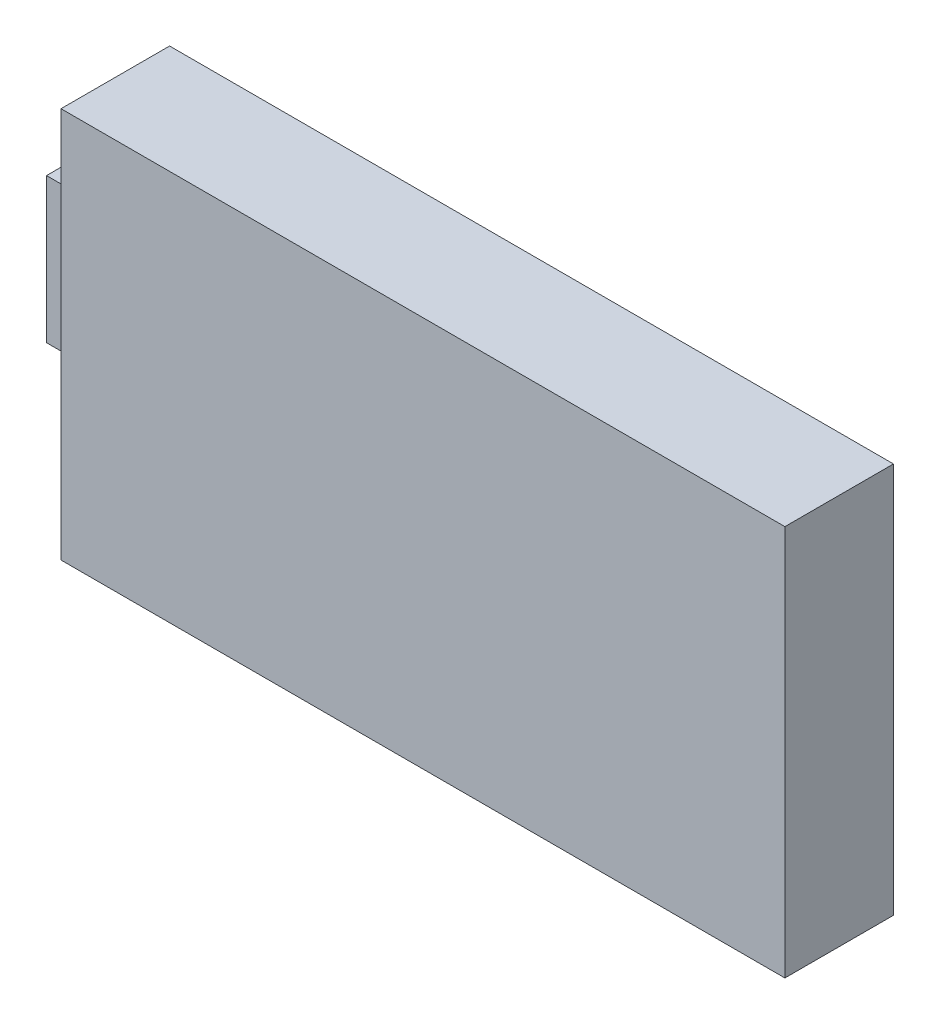
ISO-10303-21;
HEADER;
FILE_DESCRIPTION(('STEP AP214'),'2;1');
FILE_NAME('part.step','',(''),(''),'','','');
FILE_SCHEMA(('AUTOMOTIVE_DESIGN { 1 0 10303 214 1 1 1 1 }'));
ENDSEC;
DATA;
#1=APPLICATION_CONTEXT('core data for automotive mechanical design processes');
#2=APPLICATION_PROTOCOL_DEFINITION('international standard','automotive_design',2000,#1);
#3=PRODUCT_CONTEXT('',#1,'mechanical');
#4=PRODUCT('Part','Part','',(#3));
#5=PRODUCT_RELATED_PRODUCT_CATEGORY('part','',(#4));
#6=PRODUCT_DEFINITION_FORMATION('','',#4);
#7=PRODUCT_DEFINITION_CONTEXT('part definition',#1,'design');
#8=PRODUCT_DEFINITION('design','',#6,#7);
#9=PRODUCT_DEFINITION_SHAPE('','',#8);
#10=(LENGTH_UNIT() NAMED_UNIT(*) SI_UNIT(.MILLI.,.METRE.));
#11=(NAMED_UNIT(*) PLANE_ANGLE_UNIT() SI_UNIT($,.RADIAN.));
#12=(NAMED_UNIT(*) SI_UNIT($,.STERADIAN.) SOLID_ANGLE_UNIT());
#13=UNCERTAINTY_MEASURE_WITH_UNIT(LENGTH_MEASURE(1.E-05),#10,'distance_accuracy_value','');
#14=(GEOMETRIC_REPRESENTATION_CONTEXT(3) GLOBAL_UNCERTAINTY_ASSIGNED_CONTEXT((#13)) GLOBAL_UNIT_ASSIGNED_CONTEXT((#10,
#11,#12)) REPRESENTATION_CONTEXT('',''));
#15=CARTESIAN_POINT('',(0.,0.,0.));
#16=DIRECTION('',(0.,0.,1.));
#17=DIRECTION('',(1.,0.,0.));
#18=AXIS2_PLACEMENT_3D('',#15,#16,#17);
#19=CARTESIAN_POINT('',(-25.,13.5,7.5));
#20=DIRECTION('',(1.,0.,0.));
#21=DIRECTION('',(0.,1.,0.));
#22=AXIS2_PLACEMENT_3D('',#19,#20,#21);
#23=PLANE('',#22);
#24=DIRECTION('',(0.,0.,-1.));
#25=VECTOR('',#24,1.);
#26=CARTESIAN_POINT('',(-25.,5.,0.));
#27=LINE('',#26,#25);
#28=CARTESIAN_POINT('',(-25.,5.,3.5));
#29=VERTEX_POINT('',#28);
#30=CARTESIAN_POINT('',(-25.,5.,0.));
#31=VERTEX_POINT('',#30);
#32=EDGE_CURVE('E52',#29,#31,#27,.T.);
#33=ORIENTED_EDGE('',*,*,#32,.F.);
#34=DIRECTION('',(0.,1.,0.));
#35=VECTOR('',#34,1.);
#36=CARTESIAN_POINT('',(-25.,5.,3.5));
#37=LINE('',#36,#35);
#38=CARTESIAN_POINT('',(-25.,-5.,3.5));
#39=VERTEX_POINT('',#38);
#40=EDGE_CURVE('E139',#39,#29,#37,.T.);
#41=ORIENTED_EDGE('',*,*,#40,.F.);
#42=DIRECTION('',(0.,0.,1.));
#43=VECTOR('',#42,1.);
#44=CARTESIAN_POINT('',(-25.,-5.,0.));
#45=LINE('',#44,#43);
#46=CARTESIAN_POINT('',(-25.,-5.,0.));
#47=VERTEX_POINT('',#46);
#48=EDGE_CURVE('E58',#47,#39,#45,.T.);
#49=ORIENTED_EDGE('',*,*,#48,.F.);
#50=DIRECTION('',(0.,-1.,0.));
#51=VECTOR('',#50,1.);
#52=CARTESIAN_POINT('',(-25.,13.5,0.));
#53=LINE('',#52,#51);
#54=CARTESIAN_POINT('',(-25.,-13.5,0.));
#55=VERTEX_POINT('',#54);
#56=EDGE_CURVE('E124',#47,#55,#53,.T.);
#57=ORIENTED_EDGE('',*,*,#56,.T.);
#58=DIRECTION('',(0.,0.,-1.));
#59=VECTOR('',#58,1.);
#60=CARTESIAN_POINT('',(-25.,-13.5,7.5));
#61=LINE('',#60,#59);
#62=CARTESIAN_POINT('',(-25.,-13.5,7.5));
#63=VERTEX_POINT('',#62);
#64=EDGE_CURVE('E169',#63,#55,#61,.T.);
#65=ORIENTED_EDGE('',*,*,#64,.F.);
#66=DIRECTION('',(0.,-1.,0.));
#67=VECTOR('',#66,1.);
#68=CARTESIAN_POINT('',(-25.,13.5,7.5));
#69=LINE('',#68,#67);
#70=CARTESIAN_POINT('',(-25.,13.5,7.5));
#71=VERTEX_POINT('',#70);
#72=EDGE_CURVE('E153',#71,#63,#69,.T.);
#73=ORIENTED_EDGE('',*,*,#72,.F.);
#74=DIRECTION('',(0.,0.,-1.));
#75=VECTOR('',#74,1.);
#76=CARTESIAN_POINT('',(-25.,13.5,7.5));
#77=LINE('',#76,#75);
#78=CARTESIAN_POINT('',(-25.,13.5,0.));
#79=VERTEX_POINT('',#78);
#80=EDGE_CURVE('E44',#71,#79,#77,.T.);
#81=ORIENTED_EDGE('',*,*,#80,.T.);
#82=EDGE_CURVE('E165',#79,#31,#53,.T.);
#83=ORIENTED_EDGE('',*,*,#82,.T.);
#84=EDGE_LOOP('',(#33,#41,#49,#57,#65,#73,#81,#83));
#85=FACE_BOUND('',#84,.T.);
#86=ADVANCED_FACE('F35',(#85),#23,.F.);
#87=CARTESIAN_POINT('',(25.,13.5,7.5));
#88=DIRECTION('',(-1.,0.,0.));
#89=DIRECTION('',(0.,-1.,0.));
#90=AXIS2_PLACEMENT_3D('',#87,#88,#89);
#91=PLANE('',#90);
#92=DIRECTION('',(0.,1.,0.));
#93=VECTOR('',#92,1.);
#94=CARTESIAN_POINT('',(25.,13.5,0.));
#95=LINE('',#94,#93);
#96=CARTESIAN_POINT('',(25.,-13.5,0.));
#97=VERTEX_POINT('',#96);
#98=CARTESIAN_POINT('',(25.,13.5,0.));
#99=VERTEX_POINT('',#98);
#100=EDGE_CURVE('E125',#97,#99,#95,.T.);
#101=ORIENTED_EDGE('',*,*,#100,.T.);
#102=DIRECTION('',(0.,0.,-1.));
#103=VECTOR('',#102,1.);
#104=CARTESIAN_POINT('',(25.,13.5,7.5));
#105=LINE('',#104,#103);
#106=CARTESIAN_POINT('',(25.,13.5,7.5));
#107=VERTEX_POINT('',#106);
#108=EDGE_CURVE('E11',#107,#99,#105,.T.);
#109=ORIENTED_EDGE('',*,*,#108,.F.);
#110=DIRECTION('',(0.,1.,0.));
#111=VECTOR('',#110,1.);
#112=CARTESIAN_POINT('',(25.,13.5,7.5));
#113=LINE('',#112,#111);
#114=CARTESIAN_POINT('',(25.,-13.5,7.5));
#115=VERTEX_POINT('',#114);
#116=EDGE_CURVE('E147',#115,#107,#113,.T.);
#117=ORIENTED_EDGE('',*,*,#116,.F.);
#118=DIRECTION('',(0.,0.,-1.));
#119=VECTOR('',#118,1.);
#120=CARTESIAN_POINT('',(25.,-13.5,7.5));
#121=LINE('',#120,#119);
#122=EDGE_CURVE('E156',#115,#97,#121,.T.);
#123=ORIENTED_EDGE('',*,*,#122,.T.);
#124=EDGE_LOOP('',(#101,#109,#117,#123));
#125=FACE_BOUND('',#124,.T.);
#126=ADVANCED_FACE('F37',(#125),#91,.F.);
#127=CARTESIAN_POINT('',(-25.,13.5,7.5));
#128=DIRECTION('',(0.,-1.,0.));
#129=DIRECTION('',(0.,0.,-1.));
#130=AXIS2_PLACEMENT_3D('',#127,#128,#129);
#131=PLANE('',#130);
#132=DIRECTION('',(-1.,0.,0.));
#133=VECTOR('',#132,1.);
#134=CARTESIAN_POINT('',(-25.,13.5,0.));
#135=LINE('',#134,#133);
#136=EDGE_CURVE('E128',#99,#79,#135,.T.);
#137=ORIENTED_EDGE('',*,*,#136,.T.);
#138=ORIENTED_EDGE('',*,*,#80,.F.);
#139=DIRECTION('',(-1.,0.,0.));
#140=VECTOR('',#139,1.);
#141=CARTESIAN_POINT('',(-25.,13.5,7.5));
#142=LINE('',#141,#140);
#143=EDGE_CURVE('E150',#107,#71,#142,.T.);
#144=ORIENTED_EDGE('',*,*,#143,.F.);
#145=ORIENTED_EDGE('',*,*,#108,.T.);
#146=EDGE_LOOP('',(#137,#138,#144,#145));
#147=FACE_BOUND('',#146,.T.);
#148=ADVANCED_FACE('F181',(#147),#131,.F.);
#149=CARTESIAN_POINT('',(-25.,-13.5,7.5));
#150=DIRECTION('',(0.,1.,0.));
#151=DIRECTION('',(0.,0.,1.));
#152=AXIS2_PLACEMENT_3D('',#149,#150,#151);
#153=PLANE('',#152);
#154=DIRECTION('',(1.,0.,0.));
#155=VECTOR('',#154,1.);
#156=CARTESIAN_POINT('',(-25.,-13.5,0.));
#157=LINE('',#156,#155);
#158=EDGE_CURVE('E151',#55,#97,#157,.T.);
#159=ORIENTED_EDGE('',*,*,#158,.T.);
#160=ORIENTED_EDGE('',*,*,#122,.F.);
#161=DIRECTION('',(1.,0.,0.));
#162=VECTOR('',#161,1.);
#163=CARTESIAN_POINT('',(-25.,-13.5,7.5));
#164=LINE('',#163,#162);
#165=EDGE_CURVE('E155',#63,#115,#164,.T.);
#166=ORIENTED_EDGE('',*,*,#165,.F.);
#167=ORIENTED_EDGE('',*,*,#64,.T.);
#168=EDGE_LOOP('',(#159,#160,#166,#167));
#169=FACE_BOUND('',#168,.T.);
#170=ADVANCED_FACE('F186',(#169),#153,.F.);
#171=CARTESIAN_POINT('',(0.,0.,7.5));
#172=DIRECTION('',(0.,0.,1.));
#173=DIRECTION('',(1.,0.,0.));
#174=AXIS2_PLACEMENT_3D('',#171,#172,#173);
#175=PLANE('',#174);
#176=ORIENTED_EDGE('',*,*,#116,.T.);
#177=ORIENTED_EDGE('',*,*,#143,.T.);
#178=ORIENTED_EDGE('',*,*,#72,.T.);
#179=ORIENTED_EDGE('',*,*,#165,.T.);
#180=EDGE_LOOP('',(#176,#177,#178,#179));
#181=FACE_BOUND('',#180,.T.);
#182=ADVANCED_FACE('F184',(#181),#175,.T.);
#183=CARTESIAN_POINT('',(0.,0.,0.));
#184=DIRECTION('',(0.,0.,1.));
#185=DIRECTION('',(1.,0.,0.));
#186=AXIS2_PLACEMENT_3D('',#183,#184,#185);
#187=PLANE('',#186);
#188=ORIENTED_EDGE('',*,*,#100,.F.);
#189=ORIENTED_EDGE('',*,*,#158,.F.);
#190=ORIENTED_EDGE('',*,*,#56,.F.);
#191=DIRECTION('',(1.,0.,0.));
#192=VECTOR('',#191,1.);
#193=CARTESIAN_POINT('',(-30.,-5.,0.));
#194=LINE('',#193,#192);
#195=CARTESIAN_POINT('',(-30.,-5.,0.));
#196=VERTEX_POINT('',#195);
#197=EDGE_CURVE('E105',#196,#47,#194,.T.);
#198=ORIENTED_EDGE('',*,*,#197,.F.);
#199=DIRECTION('',(0.,-1.,0.));
#200=VECTOR('',#199,1.);
#201=CARTESIAN_POINT('',(-30.,5.,0.));
#202=LINE('',#201,#200);
#203=CARTESIAN_POINT('',(-30.,5.,0.));
#204=VERTEX_POINT('',#203);
#205=EDGE_CURVE('E111',#204,#196,#202,.T.);
#206=ORIENTED_EDGE('',*,*,#205,.F.);
#207=DIRECTION('',(1.,0.,0.));
#208=VECTOR('',#207,1.);
#209=CARTESIAN_POINT('',(-30.,5.,0.));
#210=LINE('',#209,#208);
#211=EDGE_CURVE('E140',#204,#31,#210,.T.);
#212=ORIENTED_EDGE('',*,*,#211,.T.);
#213=ORIENTED_EDGE('',*,*,#82,.F.);
#214=ORIENTED_EDGE('',*,*,#136,.F.);
#215=EDGE_LOOP('',(#188,#189,#190,#198,#206,#212,#213,#214));
#216=FACE_BOUND('',#215,.T.);
#217=ADVANCED_FACE('F122',(#216),#187,.F.);
#218=CARTESIAN_POINT('',(-30.,-5.,0.));
#219=DIRECTION('',(0.,1.,0.));
#220=DIRECTION('',(-1.,0.,0.));
#221=AXIS2_PLACEMENT_3D('',#218,#219,#220);
#222=PLANE('',#221);
#223=ORIENTED_EDGE('',*,*,#48,.T.);
#224=DIRECTION('',(1.,0.,0.));
#225=VECTOR('',#224,1.);
#226=CARTESIAN_POINT('',(-30.,-5.,3.5));
#227=LINE('',#226,#225);
#228=CARTESIAN_POINT('',(-30.,-5.,3.5));
#229=VERTEX_POINT('',#228);
#230=EDGE_CURVE('E107',#229,#39,#227,.T.);
#231=ORIENTED_EDGE('',*,*,#230,.F.);
#232=DIRECTION('',(0.,0.,1.));
#233=VECTOR('',#232,1.);
#234=CARTESIAN_POINT('',(-30.,-5.,0.));
#235=LINE('',#234,#233);
#236=EDGE_CURVE('E101',#196,#229,#235,.T.);
#237=ORIENTED_EDGE('',*,*,#236,.F.);
#238=ORIENTED_EDGE('',*,*,#197,.T.);
#239=EDGE_LOOP('',(#223,#231,#237,#238));
#240=FACE_BOUND('',#239,.T.);
#241=ADVANCED_FACE('F103',(#240),#222,.F.);
#242=CARTESIAN_POINT('',(-30.,5.,3.5));
#243=DIRECTION('',(0.,0.,-1.));
#244=DIRECTION('',(0.,1.,0.));
#245=AXIS2_PLACEMENT_3D('',#242,#243,#244);
#246=PLANE('',#245);
#247=ORIENTED_EDGE('',*,*,#40,.T.);
#248=DIRECTION('',(1.,0.,0.));
#249=VECTOR('',#248,1.);
#250=CARTESIAN_POINT('',(-30.,5.,3.5));
#251=LINE('',#250,#249);
#252=CARTESIAN_POINT('',(-30.,5.,3.5));
#253=VERTEX_POINT('',#252);
#254=EDGE_CURVE('E130',#253,#29,#251,.T.);
#255=ORIENTED_EDGE('',*,*,#254,.F.);
#256=DIRECTION('',(0.,1.,0.));
#257=VECTOR('',#256,1.);
#258=CARTESIAN_POINT('',(-30.,5.,3.5));
#259=LINE('',#258,#257);
#260=EDGE_CURVE('E110',#229,#253,#259,.T.);
#261=ORIENTED_EDGE('',*,*,#260,.F.);
#262=ORIENTED_EDGE('',*,*,#230,.T.);
#263=EDGE_LOOP('',(#247,#255,#261,#262));
#264=FACE_BOUND('',#263,.T.);
#265=ADVANCED_FACE('F192',(#264),#246,.F.);
#266=CARTESIAN_POINT('',(-30.,5.,0.));
#267=DIRECTION('',(0.,-1.,0.));
#268=DIRECTION('',(1.,0.,0.));
#269=AXIS2_PLACEMENT_3D('',#266,#267,#268);
#270=PLANE('',#269);
#271=ORIENTED_EDGE('',*,*,#32,.T.);
#272=ORIENTED_EDGE('',*,*,#211,.F.);
#273=DIRECTION('',(0.,0.,-1.));
#274=VECTOR('',#273,1.);
#275=CARTESIAN_POINT('',(-30.,5.,0.));
#276=LINE('',#275,#274);
#277=EDGE_CURVE('E116',#253,#204,#276,.T.);
#278=ORIENTED_EDGE('',*,*,#277,.F.);
#279=ORIENTED_EDGE('',*,*,#254,.T.);
#280=EDGE_LOOP('',(#271,#272,#278,#279));
#281=FACE_BOUND('',#280,.T.);
#282=ADVANCED_FACE('F188',(#281),#270,.F.);
#283=CARTESIAN_POINT('',(-30.,0.,0.));
#284=DIRECTION('',(-1.,0.,0.));
#285=DIRECTION('',(0.,0.,1.));
#286=AXIS2_PLACEMENT_3D('',#283,#284,#285);
#287=PLANE('',#286);
#288=ORIENTED_EDGE('',*,*,#205,.T.);
#289=ORIENTED_EDGE('',*,*,#236,.T.);
#290=ORIENTED_EDGE('',*,*,#260,.T.);
#291=ORIENTED_EDGE('',*,*,#277,.T.);
#292=EDGE_LOOP('',(#288,#289,#290,#291));
#293=FACE_BOUND('',#292,.T.);
#294=ADVANCED_FACE('F114',(#293),#287,.T.);
#295=CLOSED_SHELL('',(#86,#126,#148,#170,#182,#217,#241,#265,#282,#294));
#296=MANIFOLD_SOLID_BREP('B2',#295);
#297=ADVANCED_BREP_SHAPE_REPRESENTATION('',(#18,#296),#14);
#298=SHAPE_DEFINITION_REPRESENTATION(#9,#297);
ENDSEC;
END-ISO-10303-21;
